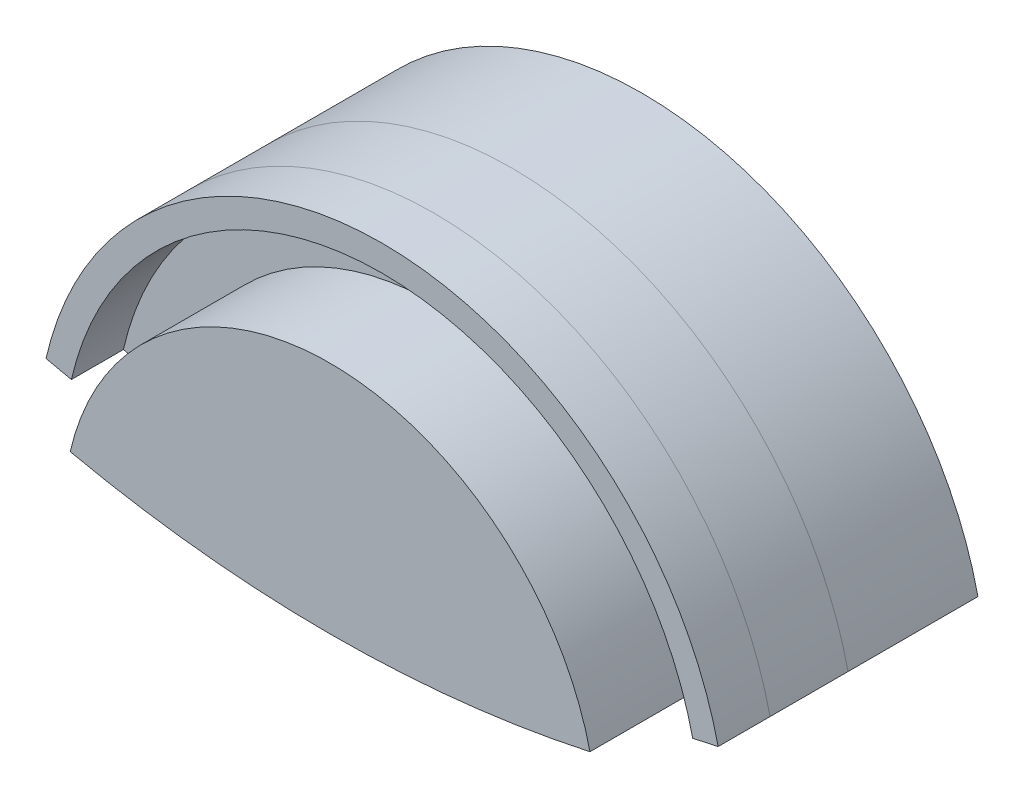
ISO-10303-21;
HEADER;
FILE_DESCRIPTION(('STEP AP214'),'2;1');
FILE_NAME('part.step','',(''),(''),'','','');
FILE_SCHEMA(('AUTOMOTIVE_DESIGN { 1 0 10303 214 1 1 1 1 }'));
ENDSEC;
DATA;
#1=APPLICATION_CONTEXT('core data for automotive mechanical design processes');
#2=APPLICATION_PROTOCOL_DEFINITION('international standard','automotive_design',2000,#1);
#3=PRODUCT_CONTEXT('',#1,'mechanical');
#4=PRODUCT('Part','Part','',(#3));
#5=PRODUCT_RELATED_PRODUCT_CATEGORY('part','',(#4));
#6=PRODUCT_DEFINITION_FORMATION('','',#4);
#7=PRODUCT_DEFINITION_CONTEXT('part definition',#1,'design');
#8=PRODUCT_DEFINITION('design','',#6,#7);
#9=PRODUCT_DEFINITION_SHAPE('','',#8);
#10=(LENGTH_UNIT() NAMED_UNIT(*) SI_UNIT(.MILLI.,.METRE.));
#11=(NAMED_UNIT(*) PLANE_ANGLE_UNIT() SI_UNIT($,.RADIAN.));
#12=(NAMED_UNIT(*) SI_UNIT($,.STERADIAN.) SOLID_ANGLE_UNIT());
#13=UNCERTAINTY_MEASURE_WITH_UNIT(LENGTH_MEASURE(1.E-05),#10,'distance_accuracy_value','');
#14=(GEOMETRIC_REPRESENTATION_CONTEXT(3) GLOBAL_UNCERTAINTY_ASSIGNED_CONTEXT((#13)) GLOBAL_UNIT_ASSIGNED_CONTEXT((#10,
#11,#12)) REPRESENTATION_CONTEXT('',''));
#15=CARTESIAN_POINT('',(0.,0.,0.));
#16=DIRECTION('',(0.,0.,1.));
#17=DIRECTION('',(1.,0.,0.));
#18=AXIS2_PLACEMENT_3D('',#15,#16,#17);
#19=CARTESIAN_POINT('',(0.0414765336146972,22.9869902243858,7.));
#20=DIRECTION('',(0.,0.,-1.));
#21=DIRECTION('',(-1.,0.,0.));
#22=AXIS2_PLACEMENT_3D('',#19,#20,#21);
#23=CYLINDRICAL_SURFACE('',#22,23.5);
#24=CARTESIAN_POINT('',(0.0414765336146972,22.9869902243858,5.));
#25=DIRECTION('',(0.,0.,1.));
#26=DIRECTION('',(-1.,0.,0.));
#27=AXIS2_PLACEMENT_3D('',#24,#25,#26);
#28=CIRCLE('',#27,23.5);
#29=CARTESIAN_POINT('',(-4.95852354089112,0.0250652341995032,5.));
#30=VERTEX_POINT('',#29);
#31=CARTESIAN_POINT('',(5.04147660812051,0.0250652341995026,5.));
#32=VERTEX_POINT('',#31);
#33=EDGE_CURVE('P0_E82',#30,#32,#28,.T.);
#34=ORIENTED_EDGE('',*,*,#33,.T.);
#35=DIRECTION('',(0.,0.,-1.));
#36=VECTOR('',#35,1.);
#37=CARTESIAN_POINT('',(5.04147660812051,0.0250652341995026,7.));
#38=LINE('',#37,#36);
#39=CARTESIAN_POINT('',(5.04147660812051,0.0250652341995026,7.));
#40=VERTEX_POINT('',#39);
#41=EDGE_CURVE('P0_E12',#40,#32,#38,.T.);
#42=ORIENTED_EDGE('',*,*,#41,.F.);
#43=CARTESIAN_POINT('',(0.0414765336146972,22.9869902243858,7.));
#44=DIRECTION('',(0.,0.,1.));
#45=DIRECTION('',(-1.,0.,0.));
#46=AXIS2_PLACEMENT_3D('',#43,#44,#45);
#47=CIRCLE('',#46,23.5);
#48=CARTESIAN_POINT('',(-4.95852354089112,0.0250652341995032,7.));
#49=VERTEX_POINT('',#48);
#50=EDGE_CURVE('P0_E81',#49,#40,#47,.T.);
#51=ORIENTED_EDGE('',*,*,#50,.F.);
#52=DIRECTION('',(0.,0.,-1.));
#53=VECTOR('',#52,1.);
#54=CARTESIAN_POINT('',(-4.95852354089112,0.0250652341995032,7.));
#55=LINE('',#54,#53);
#56=EDGE_CURVE('P0_E59',#49,#30,#55,.T.);
#57=ORIENTED_EDGE('',*,*,#56,.T.);
#58=EDGE_LOOP('',(#34,#42,#51,#57));
#59=FACE_BOUND('',#58,.T.);
#60=ADVANCED_FACE('P0_F51',(#59),#23,.T.);
#61=CARTESIAN_POINT('',(0.0414765336146947,-1.13195670201066,7.));
#62=DIRECTION('',(0.,0.,-1.));
#63=DIRECTION('',(-1.,0.,0.));
#64=AXIS2_PLACEMENT_3D('',#61,#62,#63);
#65=CYLINDRICAL_SURFACE('',#64,5.13212436578944);
#66=CARTESIAN_POINT('',(0.0414765336146947,-1.13195670201066,5.));
#67=DIRECTION('',(0.,0.,1.));
#68=DIRECTION('',(-1.,0.,0.));
#69=AXIS2_PLACEMENT_3D('',#66,#67,#68);
#70=CIRCLE('',#69,5.13212436578944);
#71=EDGE_CURVE('P0_E74',#32,#30,#70,.T.);
#72=ORIENTED_EDGE('',*,*,#71,.T.);
#73=ORIENTED_EDGE('',*,*,#56,.F.);
#74=CARTESIAN_POINT('',(0.0414765336146947,-1.13195670201066,7.));
#75=DIRECTION('',(0.,0.,1.));
#76=DIRECTION('',(-1.,0.,0.));
#77=AXIS2_PLACEMENT_3D('',#74,#75,#76);
#78=CIRCLE('',#77,5.13212436578944);
#79=EDGE_CURVE('P0_E66',#40,#49,#78,.T.);
#80=ORIENTED_EDGE('',*,*,#79,.F.);
#81=ORIENTED_EDGE('',*,*,#41,.T.);
#82=EDGE_LOOP('',(#72,#73,#80,#81));
#83=FACE_BOUND('',#82,.T.);
#84=ADVANCED_FACE('P0_F77',(#83),#65,.T.);
#85=CARTESIAN_POINT('',(0.0414765336146959,10.9275167611876,7.));
#86=DIRECTION('',(0.,0.,-1.));
#87=DIRECTION('',(-1.,0.,0.));
#88=AXIS2_PLACEMENT_3D('',#85,#86,#87);
#89=PLANE('',#88);
#90=ORIENTED_EDGE('',*,*,#50,.T.);
#91=ORIENTED_EDGE('',*,*,#79,.T.);
#92=EDGE_LOOP('',(#90,#91));
#93=FACE_BOUND('',#92,.T.);
#94=ADVANCED_FACE('P0_F89',(#93),#89,.F.);
#95=CARTESIAN_POINT('',(0.0414765336146959,10.9275167611876,5.));
#96=DIRECTION('',(0.,0.,-1.));
#97=DIRECTION('',(-1.,0.,0.));
#98=AXIS2_PLACEMENT_3D('',#95,#96,#97);
#99=PLANE('',#98);
#100=ORIENTED_EDGE('',*,*,#33,.F.);
#101=ORIENTED_EDGE('',*,*,#71,.F.);
#102=EDGE_LOOP('',(#100,#101));
#103=FACE_BOUND('',#102,.T.);
#104=ADVANCED_FACE('P0_F85',(#103),#99,.T.);
#105=CLOSED_SHELL('',(#60,#84,#94,#104));
#106=MANIFOLD_SOLID_BREP('P0_B2',#105);
#107=CARTESIAN_POINT('',(0.0414765336146947,-1.13195670201066,6.));
#108=DIRECTION('',(0.,0.,-1.));
#109=DIRECTION('',(-1.,0.,0.));
#110=AXIS2_PLACEMENT_3D('',#107,#108,#109);
#111=CYLINDRICAL_SURFACE('',#110,6.63212436578944);
#112=CARTESIAN_POINT('',(0.0414765336146947,-1.13195670201066,5.));
#113=DIRECTION('',(0.,0.,1.));
#114=DIRECTION('',(-1.,0.,0.));
#115=AXIS2_PLACEMENT_3D('',#112,#113,#114);
#116=CIRCLE('',#115,6.63212436578944);
#117=CARTESIAN_POINT('',(6.50722719067548,0.344235034863654,5.));
#118=VERTEX_POINT('',#117);
#119=CARTESIAN_POINT('',(-6.42427412344609,0.344235034863653,5.));
#120=VERTEX_POINT('',#119);
#121=EDGE_CURVE('P0_E195',#118,#120,#116,.T.);
#122=ORIENTED_EDGE('',*,*,#121,.T.);
#123=DIRECTION('',(0.,0.,-1.));
#124=VECTOR('',#123,1.);
#125=CARTESIAN_POINT('',(-6.42427412344609,0.344235034863653,6.));
#126=LINE('',#125,#124);
#127=CARTESIAN_POINT('',(-6.42427412344609,0.344235034863653,6.));
#128=VERTEX_POINT('',#127);
#129=EDGE_CURVE('P0_E49',#128,#120,#126,.T.);
#130=ORIENTED_EDGE('',*,*,#129,.F.);
#131=CARTESIAN_POINT('',(0.0414765336146947,-1.13195670201066,6.));
#132=DIRECTION('',(0.,0.,1.));
#133=DIRECTION('',(-1.,0.,0.));
#134=AXIS2_PLACEMENT_3D('',#131,#132,#133);
#135=CIRCLE('',#134,6.63212436578944);
#136=CARTESIAN_POINT('',(6.50722719067548,0.344235034863654,6.));
#137=VERTEX_POINT('',#136);
#138=EDGE_CURVE('P0_E183',#137,#128,#135,.T.);
#139=ORIENTED_EDGE('',*,*,#138,.F.);
#140=DIRECTION('',(0.,0.,-1.));
#141=VECTOR('',#140,1.);
#142=CARTESIAN_POINT('',(6.50722719067548,0.344235034863654,6.));
#143=LINE('',#142,#141);
#144=EDGE_CURVE('P0_E191',#137,#118,#143,.T.);
#145=ORIENTED_EDGE('',*,*,#144,.T.);
#146=EDGE_LOOP('',(#122,#130,#139,#145));
#147=FACE_BOUND('',#146,.T.);
#148=ADVANCED_FACE('P0_F132',(#147),#111,.T.);
#149=CARTESIAN_POINT('',(-5.93569580373622,0.237846235318521,6.));
#150=DIRECTION('',(0.212765960617266,0.977103191071758,0.));
#151=DIRECTION('',(-0.977103191071758,0.212765960617266,0.));
#152=AXIS2_PLACEMENT_3D('',#149,#150,#151);
#153=PLANE('',#152);
#154=DIRECTION('',(0.977103191071758,-0.212765960617266,0.));
#155=VECTOR('',#154,1.);
#156=CARTESIAN_POINT('',(-5.93569580373622,0.237846235318521,5.));
#157=LINE('',#156,#155);
#158=CARTESIAN_POINT('',(-5.93569580373622,0.237846235318521,5.));
#159=VERTEX_POINT('',#158);
#160=EDGE_CURVE('P0_E187',#120,#159,#157,.T.);
#161=ORIENTED_EDGE('',*,*,#160,.T.);
#162=DIRECTION('',(0.,0.,-1.));
#163=VECTOR('',#162,1.);
#164=CARTESIAN_POINT('',(-5.93569580373622,0.237846235318521,6.));
#165=LINE('',#164,#163);
#166=CARTESIAN_POINT('',(-5.93569580373622,0.237846235318521,6.));
#167=VERTEX_POINT('',#166);
#168=EDGE_CURVE('P0_E140',#167,#159,#165,.T.);
#169=ORIENTED_EDGE('',*,*,#168,.F.);
#170=DIRECTION('',(0.977103191071758,-0.212765960617266,0.));
#171=VECTOR('',#170,1.);
#172=CARTESIAN_POINT('',(-5.93569580373622,0.237846235318521,6.));
#173=LINE('',#172,#171);
#174=EDGE_CURVE('P0_E178',#128,#167,#173,.T.);
#175=ORIENTED_EDGE('',*,*,#174,.F.);
#176=ORIENTED_EDGE('',*,*,#129,.T.);
#177=EDGE_LOOP('',(#161,#169,#175,#176));
#178=FACE_BOUND('',#177,.T.);
#179=ADVANCED_FACE('P0_F186',(#178),#153,.F.);
#180=CARTESIAN_POINT('',(0.0414765336146947,-1.13195670201066,6.));
#181=DIRECTION('',(0.,0.,-1.));
#182=DIRECTION('',(-1.,0.,0.));
#183=AXIS2_PLACEMENT_3D('',#180,#181,#182);
#184=CYLINDRICAL_SURFACE('',#183,6.13212436578944);
#185=CARTESIAN_POINT('',(0.0414765336146947,-1.13195670201066,5.));
#186=DIRECTION('',(0.,0.,-1.));
#187=DIRECTION('',(1.,0.,0.));
#188=AXIS2_PLACEMENT_3D('',#185,#186,#187);
#189=CIRCLE('',#188,6.13212436578944);
#190=CARTESIAN_POINT('',(6.0186488709656,0.237846235318519,5.));
#191=VERTEX_POINT('',#190);
#192=EDGE_CURVE('P0_E165',#159,#191,#189,.T.);
#193=ORIENTED_EDGE('',*,*,#192,.T.);
#194=DIRECTION('',(0.,0.,-1.));
#195=VECTOR('',#194,1.);
#196=CARTESIAN_POINT('',(6.0186488709656,0.237846235318519,6.));
#197=LINE('',#196,#195);
#198=CARTESIAN_POINT('',(6.0186488709656,0.237846235318519,6.));
#199=VERTEX_POINT('',#198);
#200=EDGE_CURVE('P0_E188',#199,#191,#197,.T.);
#201=ORIENTED_EDGE('',*,*,#200,.F.);
#202=CARTESIAN_POINT('',(0.0414765336146947,-1.13195670201066,6.));
#203=DIRECTION('',(0.,0.,-1.));
#204=DIRECTION('',(1.,0.,0.));
#205=AXIS2_PLACEMENT_3D('',#202,#203,#204);
#206=CIRCLE('',#205,6.13212436578944);
#207=EDGE_CURVE('P0_E181',#167,#199,#206,.T.);
#208=ORIENTED_EDGE('',*,*,#207,.F.);
#209=ORIENTED_EDGE('',*,*,#168,.T.);
#210=EDGE_LOOP('',(#193,#201,#208,#209));
#211=FACE_BOUND('',#210,.T.);
#212=ADVANCED_FACE('P0_F189',(#211),#184,.F.);
#213=CARTESIAN_POINT('',(6.50722719067548,0.344235034863654,6.));
#214=DIRECTION('',(-0.212765960617272,0.977103191071756,0.));
#215=DIRECTION('',(-0.977103191071756,-0.212765960617272,0.));
#216=AXIS2_PLACEMENT_3D('',#213,#214,#215);
#217=PLANE('',#216);
#218=DIRECTION('',(0.977103191071756,0.212765960617272,0.));
#219=VECTOR('',#218,1.);
#220=CARTESIAN_POINT('',(6.50722719067548,0.344235034863654,5.));
#221=LINE('',#220,#219);
#222=EDGE_CURVE('P0_E171',#191,#118,#221,.T.);
#223=ORIENTED_EDGE('',*,*,#222,.T.);
#224=ORIENTED_EDGE('',*,*,#144,.F.);
#225=DIRECTION('',(0.977103191071756,0.212765960617272,0.));
#226=VECTOR('',#225,1.);
#227=CARTESIAN_POINT('',(6.50722719067548,0.344235034863654,6.));
#228=LINE('',#227,#226);
#229=EDGE_CURVE('P0_E148',#199,#137,#228,.T.);
#230=ORIENTED_EDGE('',*,*,#229,.F.);
#231=ORIENTED_EDGE('',*,*,#200,.T.);
#232=EDGE_LOOP('',(#223,#224,#230,#231));
#233=FACE_BOUND('',#232,.T.);
#234=ADVANCED_FACE('P0_F202',(#233),#217,.F.);
#235=CARTESIAN_POINT('',(0.0414765336146947,-1.13195670201066,6.));
#236=DIRECTION('',(0.,0.,-1.));
#237=DIRECTION('',(-1.,0.,0.));
#238=AXIS2_PLACEMENT_3D('',#235,#236,#237);
#239=PLANE('',#238);
#240=ORIENTED_EDGE('',*,*,#138,.T.);
#241=ORIENTED_EDGE('',*,*,#174,.T.);
#242=ORIENTED_EDGE('',*,*,#207,.T.);
#243=ORIENTED_EDGE('',*,*,#229,.T.);
#244=EDGE_LOOP('',(#240,#241,#242,#243));
#245=FACE_BOUND('',#244,.T.);
#246=ADVANCED_FACE('P0_F179',(#245),#239,.F.);
#247=CARTESIAN_POINT('',(0.0414765336146947,-1.13195670201066,5.));
#248=DIRECTION('',(0.,0.,-1.));
#249=DIRECTION('',(-1.,0.,0.));
#250=AXIS2_PLACEMENT_3D('',#247,#248,#249);
#251=PLANE('',#250);
#252=ORIENTED_EDGE('',*,*,#121,.F.);
#253=ORIENTED_EDGE('',*,*,#222,.F.);
#254=ORIENTED_EDGE('',*,*,#192,.F.);
#255=ORIENTED_EDGE('',*,*,#160,.F.);
#256=EDGE_LOOP('',(#252,#253,#254,#255));
#257=FACE_BOUND('',#256,.T.);
#258=ADVANCED_FACE('P0_F205',(#257),#251,.T.);
#259=CLOSED_SHELL('',(#148,#179,#212,#234,#246,#258));
#260=MANIFOLD_SOLID_BREP('P0_B6',#259);
#261=CARTESIAN_POINT('',(0.0414765336146938,2.49357894408232,2.));
#262=DIRECTION('',(0.,0.,1.));
#263=DIRECTION('',(1.,0.,0.));
#264=AXIS2_PLACEMENT_3D('',#261,#262,#263);
#265=PLANE('',#264);
#266=CARTESIAN_POINT('',(0.0414765336146949,-1.13195670201066,2.));
#267=DIRECTION('',(0.,0.,1.));
#268=DIRECTION('',(-1.,0.,0.));
#269=AXIS2_PLACEMENT_3D('',#266,#267,#268);
#270=CIRCLE('',#269,6.13212436578945);
#271=CARTESIAN_POINT('',(6.01864887096561,0.237846235318519,2.));
#272=VERTEX_POINT('',#271);
#273=CARTESIAN_POINT('',(-5.93569580373622,0.237846235318521,2.));
#274=VERTEX_POINT('',#273);
#275=EDGE_CURVE('P0_E337',#272,#274,#270,.T.);
#276=ORIENTED_EDGE('',*,*,#275,.F.);
#277=DIRECTION('',(0.977103191071759,0.212765960617261,0.));
#278=VECTOR('',#277,1.);
#279=CARTESIAN_POINT('',(5.0414766081205,0.0250652341995537,2.));
#280=LINE('',#279,#278);
#281=CARTESIAN_POINT('',(5.0414766081205,0.0250652341994978,2.));
#282=VERTEX_POINT('',#281);
#283=EDGE_CURVE('P0_E378',#282,#272,#280,.T.);
#284=ORIENTED_EDGE('',*,*,#283,.F.);
#285=CARTESIAN_POINT('',(0.0414765336146947,-1.13195670201066,2.));
#286=DIRECTION('',(0.,0.,-1.));
#287=DIRECTION('',(1.,0.,0.));
#288=AXIS2_PLACEMENT_3D('',#285,#286,#287);
#289=CIRCLE('',#288,5.13212436578944);
#290=CARTESIAN_POINT('',(-4.95852354089113,0.0250652341995047,2.));
#291=VERTEX_POINT('',#290);
#292=EDGE_CURVE('P0_E341',#291,#282,#289,.T.);
#293=ORIENTED_EDGE('',*,*,#292,.F.);
#294=DIRECTION('',(0.977103191071758,-0.212765960617267,0.));
#295=VECTOR('',#294,1.);
#296=CARTESIAN_POINT('',(-5.93569580373622,0.237846235318522,2.));
#297=LINE('',#296,#295);
#298=EDGE_CURVE('P0_E293',#274,#291,#297,.T.);
#299=ORIENTED_EDGE('',*,*,#298,.F.);
#300=EDGE_LOOP('',(#276,#284,#293,#299));
#301=FACE_BOUND('',#300,.T.);
#302=ADVANCED_FACE('P0_F257',(#301),#265,.F.);
#303=CARTESIAN_POINT('',(-6.4242741234461,0.344235034863655,2.));
#304=DIRECTION('',(-0.212765960617268,-0.977103191071757,0.));
#305=DIRECTION('',(0.977103191071757,-0.212765960617268,0.));
#306=AXIS2_PLACEMENT_3D('',#303,#304,#305);
#307=PLANE('',#306);
#308=DIRECTION('',(0.,0.,1.));
#309=VECTOR('',#308,1.);
#310=CARTESIAN_POINT('',(-6.42427412344609,0.344235034863652,2.));
#311=LINE('',#310,#309);
#312=CARTESIAN_POINT('',(-6.42427412344609,0.344235034863653,1.));
#313=VERTEX_POINT('',#312);
#314=CARTESIAN_POINT('',(-6.42427412344609,0.344235034863652,3.5));
#315=VERTEX_POINT('',#314);
#316=EDGE_CURVE('P0_E275',#313,#315,#311,.T.);
#317=ORIENTED_EDGE('',*,*,#316,.F.);
#318=DIRECTION('',(-0.977103191071758,0.212765960617266,0.));
#319=VECTOR('',#318,1.);
#320=CARTESIAN_POINT('',(-6.42427412344609,0.344235034863653,1.));
#321=LINE('',#320,#319);
#322=CARTESIAN_POINT('',(-5.93569580373622,0.237846235318521,1.));
#323=VERTEX_POINT('',#322);
#324=EDGE_CURVE('P0_E320',#323,#313,#321,.T.);
#325=ORIENTED_EDGE('',*,*,#324,.F.);
#326=DIRECTION('',(0.,0.,1.));
#327=VECTOR('',#326,1.);
#328=CARTESIAN_POINT('',(-5.93569580373622,0.237846235318521,1.));
#329=LINE('',#328,#327);
#330=EDGE_CURVE('P0_E324',#323,#274,#329,.T.);
#331=ORIENTED_EDGE('',*,*,#330,.T.);
#332=ORIENTED_EDGE('',*,*,#298,.T.);
#333=DIRECTION('',(0.,0.,1.));
#334=VECTOR('',#333,1.);
#335=CARTESIAN_POINT('',(-4.95852354089113,0.0250652341995047,0.));
#336=LINE('',#335,#334);
#337=CARTESIAN_POINT('',(-4.95852354089111,0.0250652341995273,3.5));
#338=VERTEX_POINT('',#337);
#339=EDGE_CURVE('P0_E364',#338,#291,#336,.F.);
#340=ORIENTED_EDGE('',*,*,#339,.F.);
#341=DIRECTION('',(0.977103191071757,-0.212765960617268,0.));
#342=VECTOR('',#341,1.);
#343=CARTESIAN_POINT('',(-6.4242741234461,0.344235034863655,3.5));
#344=LINE('',#343,#342);
#345=EDGE_CURVE('P0_E285',#338,#315,#344,.F.);
#346=ORIENTED_EDGE('',*,*,#345,.T.);
#347=EDGE_LOOP('',(#317,#325,#331,#332,#340,#346));
#348=FACE_BOUND('',#347,.T.);
#349=ADVANCED_FACE('P0_F322',(#348),#307,.T.);
#350=CARTESIAN_POINT('',(5.0414766081205,0.0250652341995529,2.));
#351=DIRECTION('',(0.212765960617268,-0.977103191071757,0.));
#352=DIRECTION('',(0.977103191071757,0.212765960617268,0.));
#353=AXIS2_PLACEMENT_3D('',#350,#351,#352);
#354=PLANE('',#353);
#355=ORIENTED_EDGE('',*,*,#283,.T.);
#356=DIRECTION('',(0.,0.,1.));
#357=VECTOR('',#356,1.);
#358=CARTESIAN_POINT('',(6.01864887096561,0.237846235318519,1.));
#359=LINE('',#358,#357);
#360=CARTESIAN_POINT('',(6.01864887096561,0.237846235318519,1.));
#361=VERTEX_POINT('',#360);
#362=EDGE_CURVE('P0_E342',#361,#272,#359,.T.);
#363=ORIENTED_EDGE('',*,*,#362,.F.);
#364=DIRECTION('',(-0.977103191071757,-0.21276596061727,0.));
#365=VECTOR('',#364,1.);
#366=CARTESIAN_POINT('',(6.01864887096561,0.237846235318519,1.));
#367=LINE('',#366,#365);
#368=CARTESIAN_POINT('',(6.50722719067548,0.344235034863654,1.));
#369=VERTEX_POINT('',#368);
#370=EDGE_CURVE('P0_E334',#369,#361,#367,.T.);
#371=ORIENTED_EDGE('',*,*,#370,.F.);
#372=DIRECTION('',(0.,0.,1.));
#373=VECTOR('',#372,1.);
#374=CARTESIAN_POINT('',(6.50722719067548,0.344235034863654,2.));
#375=LINE('',#374,#373);
#376=CARTESIAN_POINT('',(6.50722719067548,0.344235034863655,3.5));
#377=VERTEX_POINT('',#376);
#378=EDGE_CURVE('P0_E363',#377,#369,#375,.F.);
#379=ORIENTED_EDGE('',*,*,#378,.F.);
#380=DIRECTION('',(0.977103191071757,0.212765960617268,0.));
#381=VECTOR('',#380,1.);
#382=CARTESIAN_POINT('',(5.0414766081205,0.0250652341995529,3.5));
#383=LINE('',#382,#381);
#384=CARTESIAN_POINT('',(5.04147660812049,0.0250652341995238,3.5));
#385=VERTEX_POINT('',#384);
#386=EDGE_CURVE('P0_E406',#377,#385,#383,.F.);
#387=ORIENTED_EDGE('',*,*,#386,.T.);
#388=DIRECTION('',(0.,0.,1.));
#389=VECTOR('',#388,1.);
#390=CARTESIAN_POINT('',(5.0414766081205,0.0250652341994978,0.));
#391=LINE('',#390,#389);
#392=EDGE_CURVE('P0_E401',#282,#385,#391,.T.);
#393=ORIENTED_EDGE('',*,*,#392,.F.);
#394=EDGE_LOOP('',(#355,#363,#371,#379,#387,#393));
#395=FACE_BOUND('',#394,.T.);
#396=ADVANCED_FACE('P0_F430',(#395),#354,.T.);
#397=CARTESIAN_POINT('',(0.0414765336146947,-1.13195670201066,2.));
#398=DIRECTION('',(0.,0.,1.));
#399=DIRECTION('',(1.,0.,0.));
#400=AXIS2_PLACEMENT_3D('',#397,#398,#399);
#401=CYLINDRICAL_SURFACE('',#400,6.63212436578944);
#402=ORIENTED_EDGE('',*,*,#378,.T.);
#403=CARTESIAN_POINT('',(0.0414765336146949,-1.13195670201066,1.));
#404=DIRECTION('',(0.,0.,-1.));
#405=DIRECTION('',(1.,0.,0.));
#406=AXIS2_PLACEMENT_3D('',#403,#404,#405);
#407=CIRCLE('',#406,6.63212436578944);
#408=EDGE_CURVE('P0_E328',#313,#369,#407,.T.);
#409=ORIENTED_EDGE('',*,*,#408,.F.);
#410=ORIENTED_EDGE('',*,*,#316,.T.);
#411=CARTESIAN_POINT('',(0.0414765336146947,-1.13195670201066,3.5));
#412=DIRECTION('',(0.,0.,1.));
#413=DIRECTION('',(1.,0.,0.));
#414=AXIS2_PLACEMENT_3D('',#411,#412,#413);
#415=CIRCLE('',#414,6.63212436578944);
#416=EDGE_CURVE('P0_E130',#377,#315,#415,.T.);
#417=ORIENTED_EDGE('',*,*,#416,.F.);
#418=EDGE_LOOP('',(#402,#409,#410,#417));
#419=FACE_BOUND('',#418,.T.);
#420=ADVANCED_FACE('P0_F427',(#419),#401,.T.);
#421=CARTESIAN_POINT('',(0.0414765336146972,22.9869902243858,0.));
#422=DIRECTION('',(0.,0.,1.));
#423=DIRECTION('',(1.,0.,0.));
#424=AXIS2_PLACEMENT_3D('',#421,#422,#423);
#425=CYLINDRICAL_SURFACE('',#424,23.5);
#426=ORIENTED_EDGE('',*,*,#339,.T.);
#427=DIRECTION('',(0.,0.,1.));
#428=VECTOR('',#427,1.);
#429=CARTESIAN_POINT('',(-4.95852354089113,0.0250652341995047,0.));
#430=LINE('',#429,#428);
#431=CARTESIAN_POINT('',(-4.95852354089113,0.0250652341995047,0.));
#432=VERTEX_POINT('',#431);
#433=EDGE_CURVE('P0_E353',#432,#291,#430,.T.);
#434=ORIENTED_EDGE('',*,*,#433,.F.);
#435=CARTESIAN_POINT('',(0.0414765336146972,22.9869902243858,0.));
#436=DIRECTION('',(0.,0.,-1.));
#437=DIRECTION('',(1.,0.,0.));
#438=AXIS2_PLACEMENT_3D('',#435,#436,#437);
#439=CIRCLE('',#438,23.5);
#440=CARTESIAN_POINT('',(5.0414766081205,0.0250652341994978,0.));
#441=VERTEX_POINT('',#440);
#442=EDGE_CURVE('P0_E352',#441,#432,#439,.T.);
#443=ORIENTED_EDGE('',*,*,#442,.F.);
#444=DIRECTION('',(0.,0.,1.));
#445=VECTOR('',#444,1.);
#446=CARTESIAN_POINT('',(5.0414766081205,0.0250652341994978,0.));
#447=LINE('',#446,#445);
#448=EDGE_CURVE('P0_E357',#441,#282,#447,.T.);
#449=ORIENTED_EDGE('',*,*,#448,.T.);
#450=ORIENTED_EDGE('',*,*,#392,.T.);
#451=CARTESIAN_POINT('',(0.0414765336146972,22.9869902243858,3.5));
#452=DIRECTION('',(0.,0.,1.));
#453=DIRECTION('',(1.,0.,0.));
#454=AXIS2_PLACEMENT_3D('',#451,#452,#453);
#455=CIRCLE('',#454,23.5);
#456=EDGE_CURVE('P0_E260',#338,#385,#455,.T.);
#457=ORIENTED_EDGE('',*,*,#456,.F.);
#458=EDGE_LOOP('',(#426,#434,#443,#449,#450,#457));
#459=FACE_BOUND('',#458,.T.);
#460=ADVANCED_FACE('P0_F480',(#459),#425,.T.);
#461=CARTESIAN_POINT('',(0.0414765336146938,2.49357894408232,3.5));
#462=DIRECTION('',(0.,0.,1.));
#463=DIRECTION('',(1.,0.,0.));
#464=AXIS2_PLACEMENT_3D('',#461,#462,#463);
#465=PLANE('',#464);
#466=ORIENTED_EDGE('',*,*,#416,.T.);
#467=ORIENTED_EDGE('',*,*,#345,.F.);
#468=ORIENTED_EDGE('',*,*,#456,.T.);
#469=ORIENTED_EDGE('',*,*,#386,.F.);
#470=EDGE_LOOP('',(#466,#467,#468,#469));
#471=FACE_BOUND('',#470,.T.);
#472=ADVANCED_FACE('P0_F426',(#471),#465,.T.);
#473=CARTESIAN_POINT('',(0.0414765336146947,-1.13195670201066,0.));
#474=DIRECTION('',(0.,0.,1.));
#475=DIRECTION('',(1.,0.,0.));
#476=AXIS2_PLACEMENT_3D('',#473,#474,#475);
#477=CYLINDRICAL_SURFACE('',#476,5.13212436578944);
#478=ORIENTED_EDGE('',*,*,#292,.T.);
#479=ORIENTED_EDGE('',*,*,#448,.F.);
#480=CARTESIAN_POINT('',(0.0414765336146947,-1.13195670201066,0.));
#481=DIRECTION('',(0.,0.,-1.));
#482=DIRECTION('',(1.,0.,0.));
#483=AXIS2_PLACEMENT_3D('',#480,#481,#482);
#484=CIRCLE('',#483,5.13212436578944);
#485=EDGE_CURVE('P0_E345',#432,#441,#484,.T.);
#486=ORIENTED_EDGE('',*,*,#485,.F.);
#487=ORIENTED_EDGE('',*,*,#433,.T.);
#488=EDGE_LOOP('',(#478,#479,#486,#487));
#489=FACE_BOUND('',#488,.T.);
#490=ADVANCED_FACE('P0_F504',(#489),#477,.T.);
#491=CARTESIAN_POINT('',(0.0414765336146959,10.9275167611876,0.));
#492=DIRECTION('',(0.,0.,1.));
#493=DIRECTION('',(1.,0.,0.));
#494=AXIS2_PLACEMENT_3D('',#491,#492,#493);
#495=PLANE('',#494);
#496=ORIENTED_EDGE('',*,*,#485,.T.);
#497=ORIENTED_EDGE('',*,*,#442,.T.);
#498=EDGE_LOOP('',(#496,#497));
#499=FACE_BOUND('',#498,.T.);
#500=ADVANCED_FACE('P0_F455',(#499),#495,.F.);
#501=CARTESIAN_POINT('',(0.0414765336146949,-1.13195670201066,1.));
#502=DIRECTION('',(0.,0.,1.));
#503=DIRECTION('',(1.,0.,0.));
#504=AXIS2_PLACEMENT_3D('',#501,#502,#503);
#505=CYLINDRICAL_SURFACE('',#504,6.13212436578945);
#506=ORIENTED_EDGE('',*,*,#275,.T.);
#507=ORIENTED_EDGE('',*,*,#330,.F.);
#508=CARTESIAN_POINT('',(0.0414765336146949,-1.13195670201066,1.));
#509=DIRECTION('',(0.,0.,1.));
#510=DIRECTION('',(-1.,0.,0.));
#511=AXIS2_PLACEMENT_3D('',#508,#509,#510);
#512=CIRCLE('',#511,6.13212436578945);
#513=EDGE_CURVE('P0_E329',#361,#323,#512,.T.);
#514=ORIENTED_EDGE('',*,*,#513,.F.);
#515=ORIENTED_EDGE('',*,*,#362,.T.);
#516=EDGE_LOOP('',(#506,#507,#514,#515));
#517=FACE_BOUND('',#516,.T.);
#518=ADVANCED_FACE('P0_F339',(#517),#505,.F.);
#519=CARTESIAN_POINT('',(0.0414765336146949,-1.13195670201066,1.));
#520=DIRECTION('',(0.,0.,-1.));
#521=DIRECTION('',(-1.,0.,0.));
#522=AXIS2_PLACEMENT_3D('',#519,#520,#521);
#523=PLANE('',#522);
#524=ORIENTED_EDGE('',*,*,#513,.T.);
#525=ORIENTED_EDGE('',*,*,#324,.T.);
#526=ORIENTED_EDGE('',*,*,#408,.T.);
#527=ORIENTED_EDGE('',*,*,#370,.T.);
#528=EDGE_LOOP('',(#524,#525,#526,#527));
#529=FACE_BOUND('',#528,.T.);
#530=ADVANCED_FACE('P0_F332',(#529),#523,.T.);
#531=CLOSED_SHELL('',(#302,#349,#396,#420,#460,#472,#490,#500,#518,#530));
#532=MANIFOLD_SOLID_BREP('P0_B43',#531);
#533=CARTESIAN_POINT('',(0.0414765336146972,22.9869902243858,7.));
#534=DIRECTION('',(0.,0.,1.));
#535=DIRECTION('',(1.,0.,0.));
#536=AXIS2_PLACEMENT_3D('',#533,#534,#535);
#537=CYLINDRICAL_SURFACE('',#536,23.5);
#538=DIRECTION('',(0.,0.,1.));
#539=VECTOR('',#538,1.);
#540=CARTESIAN_POINT('',(5.0414766081205,0.0250652341995529,5.));
#541=LINE('',#540,#539);
#542=CARTESIAN_POINT('',(5.04147660812049,0.0250652341995516,3.5));
#543=VERTEX_POINT('',#542);
#544=CARTESIAN_POINT('',(5.0414766081205,0.0250652341995008,5.));
#545=VERTEX_POINT('',#544);
#546=EDGE_CURVE('P1_E69',#543,#545,#541,.T.);
#547=ORIENTED_EDGE('',*,*,#546,.T.);
#548=CARTESIAN_POINT('',(0.0414765336146972,22.9869902243858,5.));
#549=DIRECTION('',(0.,0.,1.));
#550=DIRECTION('',(1.,0.,0.));
#551=AXIS2_PLACEMENT_3D('',#548,#549,#550);
#552=CIRCLE('',#551,23.5);
#553=CARTESIAN_POINT('',(-4.95852354089112,0.0250652341995275,5.));
#554=VERTEX_POINT('',#553);
#555=EDGE_CURVE('P1_E58',#545,#554,#552,.F.);
#556=ORIENTED_EDGE('',*,*,#555,.T.);
#557=DIRECTION('',(0.,0.,1.));
#558=VECTOR('',#557,1.);
#559=CARTESIAN_POINT('',(-4.95852354089111,0.0250652341995509,5.));
#560=LINE('',#559,#558);
#561=CARTESIAN_POINT('',(-4.9585235408911,0.0250652341995504,3.5));
#562=VERTEX_POINT('',#561);
#563=EDGE_CURVE('P1_E76',#554,#562,#560,.F.);
#564=ORIENTED_EDGE('',*,*,#563,.T.);
#565=CARTESIAN_POINT('',(0.0414765336146972,22.9869902243858,3.5));
#566=DIRECTION('',(0.,0.,1.));
#567=DIRECTION('',(1.,0.,0.));
#568=AXIS2_PLACEMENT_3D('',#565,#566,#567);
#569=CIRCLE('',#568,23.5);
#570=EDGE_CURVE('P1_E12',#562,#543,#569,.T.);
#571=ORIENTED_EDGE('',*,*,#570,.T.);
#572=EDGE_LOOP('',(#547,#556,#564,#571));
#573=FACE_BOUND('',#572,.T.);
#574=ADVANCED_FACE('P1_F19',(#573),#537,.T.);
#575=CARTESIAN_POINT('',(0.0414765336146938,2.49357894408232,5.));
#576=DIRECTION('',(0.,0.,1.));
#577=DIRECTION('',(1.,0.,0.));
#578=AXIS2_PLACEMENT_3D('',#575,#576,#577);
#579=PLANE('',#578);
#580=DIRECTION('',(-0.977103191071757,0.212765960617268,0.));
#581=VECTOR('',#580,1.);
#582=CARTESIAN_POINT('',(-6.4242741234461,0.344235034863655,5.));
#583=LINE('',#582,#581);
#584=CARTESIAN_POINT('',(-6.42427412344609,0.344235034863653,5.));
#585=VERTEX_POINT('',#584);
#586=EDGE_CURVE('P1_E80',#585,#554,#583,.F.);
#587=ORIENTED_EDGE('',*,*,#586,.T.);
#588=ORIENTED_EDGE('',*,*,#555,.F.);
#589=DIRECTION('',(-0.977103191071757,-0.212765960617268,0.));
#590=VECTOR('',#589,1.);
#591=CARTESIAN_POINT('',(5.0414766081205,0.0250652341995529,5.));
#592=LINE('',#591,#590);
#593=CARTESIAN_POINT('',(6.50722719067548,0.344235034863652,5.));
#594=VERTEX_POINT('',#593);
#595=EDGE_CURVE('P1_E36',#545,#594,#592,.F.);
#596=ORIENTED_EDGE('',*,*,#595,.T.);
#597=CARTESIAN_POINT('',(0.0414765336146947,-1.13195670201066,5.));
#598=DIRECTION('',(0.,0.,1.));
#599=DIRECTION('',(1.,0.,0.));
#600=AXIS2_PLACEMENT_3D('',#597,#598,#599);
#601=CIRCLE('',#600,6.63212436578944);
#602=EDGE_CURVE('P1_E140',#585,#594,#601,.F.);
#603=ORIENTED_EDGE('',*,*,#602,.F.);
#604=EDGE_LOOP('',(#587,#588,#596,#603));
#605=FACE_BOUND('',#604,.T.);
#606=ADVANCED_FACE('P1_F21',(#605),#579,.T.);
#607=CARTESIAN_POINT('',(-6.4242741234461,0.344235034863655,5.));
#608=DIRECTION('',(0.212765960617268,0.977103191071757,0.));
#609=DIRECTION('',(-0.977103191071757,0.212765960617268,0.));
#610=AXIS2_PLACEMENT_3D('',#607,#608,#609);
#611=PLANE('',#610);
#612=ORIENTED_EDGE('',*,*,#586,.F.);
#613=DIRECTION('',(0.,0.,1.));
#614=VECTOR('',#613,1.);
#615=CARTESIAN_POINT('',(-6.42427412344609,0.344235034863652,5.));
#616=LINE('',#615,#614);
#617=CARTESIAN_POINT('',(-6.42427412344609,0.344235034863652,3.5));
#618=VERTEX_POINT('',#617);
#619=EDGE_CURVE('P1_E89',#618,#585,#616,.T.);
#620=ORIENTED_EDGE('',*,*,#619,.F.);
#621=DIRECTION('',(-0.977103191071757,0.212765960617268,0.));
#622=VECTOR('',#621,1.);
#623=CARTESIAN_POINT('',(-6.4242741234461,0.344235034863655,3.5));
#624=LINE('',#623,#622);
#625=EDGE_CURVE('P1_E45',#562,#618,#624,.T.);
#626=ORIENTED_EDGE('',*,*,#625,.F.);
#627=ORIENTED_EDGE('',*,*,#563,.F.);
#628=EDGE_LOOP('',(#612,#620,#626,#627));
#629=FACE_BOUND('',#628,.T.);
#630=ADVANCED_FACE('P1_F143',(#629),#611,.F.);
#631=CARTESIAN_POINT('',(5.0414766081205,0.0250652341995529,5.));
#632=DIRECTION('',(-0.212765960617268,0.977103191071757,0.));
#633=DIRECTION('',(-0.977103191071757,-0.212765960617268,0.));
#634=AXIS2_PLACEMENT_3D('',#631,#632,#633);
#635=PLANE('',#634);
#636=DIRECTION('',(0.,0.,1.));
#637=VECTOR('',#636,1.);
#638=CARTESIAN_POINT('',(6.50722719067548,0.344235034863652,5.));
#639=LINE('',#638,#637);
#640=CARTESIAN_POINT('',(6.50722719067548,0.344235034863654,3.5));
#641=VERTEX_POINT('',#640);
#642=EDGE_CURVE('P1_E128',#594,#641,#639,.F.);
#643=ORIENTED_EDGE('',*,*,#642,.F.);
#644=ORIENTED_EDGE('',*,*,#595,.F.);
#645=ORIENTED_EDGE('',*,*,#546,.F.);
#646=DIRECTION('',(-0.977103191071757,-0.212765960617268,0.));
#647=VECTOR('',#646,1.);
#648=CARTESIAN_POINT('',(5.0414766081205,0.0250652341995529,3.5));
#649=LINE('',#648,#647);
#650=EDGE_CURVE('P1_E73',#641,#543,#649,.T.);
#651=ORIENTED_EDGE('',*,*,#650,.F.);
#652=EDGE_LOOP('',(#643,#644,#645,#651));
#653=FACE_BOUND('',#652,.T.);
#654=ADVANCED_FACE('P1_F71',(#653),#635,.F.);
#655=CARTESIAN_POINT('',(0.0414765336146947,-1.13195670201066,5.));
#656=DIRECTION('',(0.,0.,1.));
#657=DIRECTION('',(1.,0.,0.));
#658=AXIS2_PLACEMENT_3D('',#655,#656,#657);
#659=CYLINDRICAL_SURFACE('',#658,6.63212436578944);
#660=ORIENTED_EDGE('',*,*,#602,.T.);
#661=ORIENTED_EDGE('',*,*,#642,.T.);
#662=CARTESIAN_POINT('',(0.0414765336146947,-1.13195670201066,3.5));
#663=DIRECTION('',(0.,0.,1.));
#664=DIRECTION('',(1.,0.,0.));
#665=AXIS2_PLACEMENT_3D('',#662,#663,#664);
#666=CIRCLE('',#665,6.63212436578944);
#667=EDGE_CURVE('P1_E23',#641,#618,#666,.T.);
#668=ORIENTED_EDGE('',*,*,#667,.T.);
#669=ORIENTED_EDGE('',*,*,#619,.T.);
#670=EDGE_LOOP('',(#660,#661,#668,#669));
#671=FACE_BOUND('',#670,.T.);
#672=ADVANCED_FACE('P1_F141',(#671),#659,.T.);
#673=CARTESIAN_POINT('',(0.0414765336146938,2.49357894408232,3.5));
#674=DIRECTION('',(0.,0.,1.));
#675=DIRECTION('',(1.,0.,0.));
#676=AXIS2_PLACEMENT_3D('',#673,#674,#675);
#677=PLANE('',#676);
#678=ORIENTED_EDGE('',*,*,#625,.T.);
#679=ORIENTED_EDGE('',*,*,#667,.F.);
#680=ORIENTED_EDGE('',*,*,#650,.T.);
#681=ORIENTED_EDGE('',*,*,#570,.F.);
#682=EDGE_LOOP('',(#678,#679,#680,#681));
#683=FACE_BOUND('',#682,.T.);
#684=ADVANCED_FACE('P1_F77',(#683),#677,.F.);
#685=CLOSED_SHELL('',(#574,#606,#630,#654,#672,#684));
#686=MANIFOLD_SOLID_BREP('P1_B1',#685);
#687=ADVANCED_BREP_SHAPE_REPRESENTATION('',(#18,#106,#260,#532,#686),#14);
#688=SHAPE_DEFINITION_REPRESENTATION(#9,#687);
ENDSEC;
END-ISO-10303-21;
